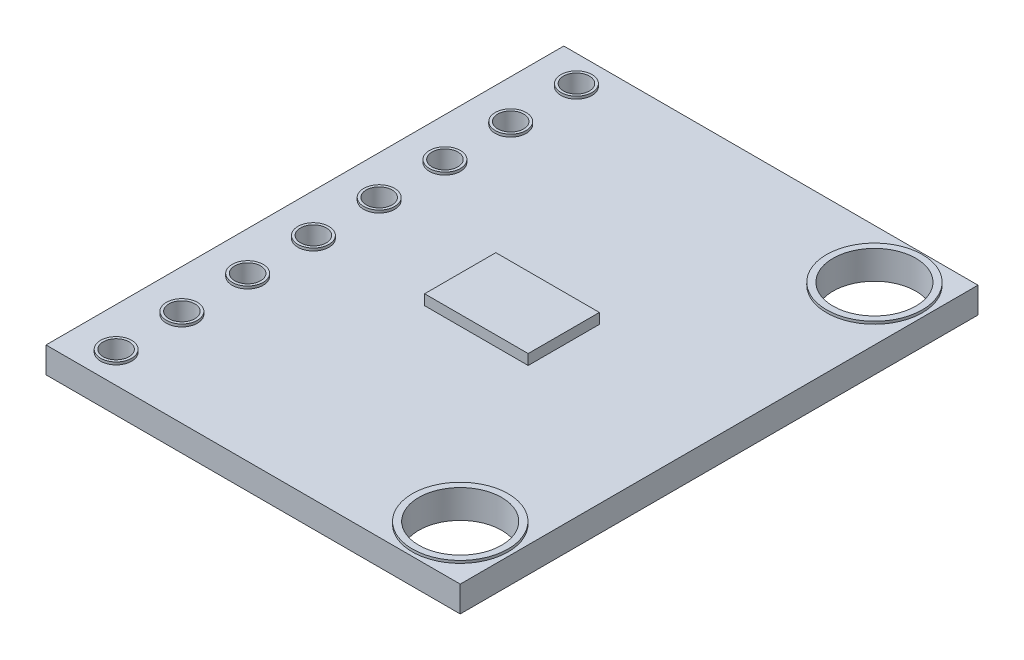
ISO-10303-21;
HEADER;
FILE_DESCRIPTION(('STEP AP214'),'2;1');
FILE_NAME('part.step','',(''),(''),'','','');
FILE_SCHEMA(('AUTOMOTIVE_DESIGN { 1 0 10303 214 1 1 1 1 }'));
ENDSEC;
DATA;
#1=APPLICATION_CONTEXT('core data for automotive mechanical design processes');
#2=APPLICATION_PROTOCOL_DEFINITION('international standard','automotive_design',2000,#1);
#3=PRODUCT_CONTEXT('',#1,'mechanical');
#4=PRODUCT('Part','Part','',(#3));
#5=PRODUCT_RELATED_PRODUCT_CATEGORY('part','',(#4));
#6=PRODUCT_DEFINITION_FORMATION('','',#4);
#7=PRODUCT_DEFINITION_CONTEXT('part definition',#1,'design');
#8=PRODUCT_DEFINITION('design','',#6,#7);
#9=PRODUCT_DEFINITION_SHAPE('','',#8);
#10=(LENGTH_UNIT() NAMED_UNIT(*) SI_UNIT(.MILLI.,.METRE.));
#11=(NAMED_UNIT(*) PLANE_ANGLE_UNIT() SI_UNIT($,.RADIAN.));
#12=(NAMED_UNIT(*) SI_UNIT($,.STERADIAN.) SOLID_ANGLE_UNIT());
#13=UNCERTAINTY_MEASURE_WITH_UNIT(LENGTH_MEASURE(1.E-05),#10,'distance_accuracy_value','');
#14=(GEOMETRIC_REPRESENTATION_CONTEXT(3) GLOBAL_UNCERTAINTY_ASSIGNED_CONTEXT((#13)) GLOBAL_UNIT_ASSIGNED_CONTEXT((#10,
#11,#12)) REPRESENTATION_CONTEXT('',''));
#15=CARTESIAN_POINT('',(0.,0.,0.));
#16=DIRECTION('',(0.,0.,1.));
#17=DIRECTION('',(1.,0.,0.));
#18=AXIS2_PLACEMENT_3D('',#15,#16,#17);
#19=CARTESIAN_POINT('',(2.,1.4,1.375));
#20=DIRECTION('',(-1.,0.,0.));
#21=DIRECTION('',(0.,0.,1.));
#22=AXIS2_PLACEMENT_3D('',#19,#20,#21);
#23=PLANE('',#22);
#24=DIRECTION('',(0.,0.,-1.));
#25=VECTOR('',#24,1.);
#26=CARTESIAN_POINT('',(2.,1.,1.375));
#27=LINE('',#26,#25);
#28=CARTESIAN_POINT('',(2.,1.,1.375));
#29=VERTEX_POINT('',#28);
#30=CARTESIAN_POINT('',(2.,1.,-1.375));
#31=VERTEX_POINT('',#30);
#32=EDGE_CURVE('E109',#29,#31,#27,.T.);
#33=ORIENTED_EDGE('',*,*,#32,.T.);
#34=DIRECTION('',(0.,-1.,0.));
#35=VECTOR('',#34,1.);
#36=CARTESIAN_POINT('',(2.,1.4,-1.375));
#37=LINE('',#36,#35);
#38=CARTESIAN_POINT('',(2.,1.4,-1.375));
#39=VERTEX_POINT('',#38);
#40=EDGE_CURVE('E12',#39,#31,#37,.T.);
#41=ORIENTED_EDGE('',*,*,#40,.F.);
#42=DIRECTION('',(0.,0.,-1.));
#43=VECTOR('',#42,1.);
#44=CARTESIAN_POINT('',(2.,1.4,1.375));
#45=LINE('',#44,#43);
#46=CARTESIAN_POINT('',(2.,1.4,1.375));
#47=VERTEX_POINT('',#46);
#48=EDGE_CURVE('E97',#47,#39,#45,.T.);
#49=ORIENTED_EDGE('',*,*,#48,.F.);
#50=DIRECTION('',(0.,-1.,0.));
#51=VECTOR('',#50,1.);
#52=CARTESIAN_POINT('',(2.,1.4,1.375));
#53=LINE('',#52,#51);
#54=EDGE_CURVE('E105',#47,#29,#53,.T.);
#55=ORIENTED_EDGE('',*,*,#54,.T.);
#56=EDGE_LOOP('',(#33,#41,#49,#55));
#57=FACE_BOUND('',#56,.T.);
#58=ADVANCED_FACE('F46',(#57),#23,.F.);
#59=CARTESIAN_POINT('',(-2.,1.4,-1.375));
#60=DIRECTION('',(0.,0.,1.));
#61=DIRECTION('',(1.,0.,0.));
#62=AXIS2_PLACEMENT_3D('',#59,#60,#61);
#63=PLANE('',#62);
#64=DIRECTION('',(-1.,0.,0.));
#65=VECTOR('',#64,1.);
#66=CARTESIAN_POINT('',(-2.,1.,-1.375));
#67=LINE('',#66,#65);
#68=CARTESIAN_POINT('',(-2.,1.,-1.375));
#69=VERTEX_POINT('',#68);
#70=EDGE_CURVE('E101',#31,#69,#67,.T.);
#71=ORIENTED_EDGE('',*,*,#70,.T.);
#72=DIRECTION('',(0.,-1.,0.));
#73=VECTOR('',#72,1.);
#74=CARTESIAN_POINT('',(-2.,1.4,-1.375));
#75=LINE('',#74,#73);
#76=CARTESIAN_POINT('',(-2.,1.4,-1.375));
#77=VERTEX_POINT('',#76);
#78=EDGE_CURVE('E54',#77,#69,#75,.T.);
#79=ORIENTED_EDGE('',*,*,#78,.F.);
#80=DIRECTION('',(-1.,0.,0.));
#81=VECTOR('',#80,1.);
#82=CARTESIAN_POINT('',(-2.,1.4,-1.375));
#83=LINE('',#82,#81);
#84=EDGE_CURVE('E92',#39,#77,#83,.T.);
#85=ORIENTED_EDGE('',*,*,#84,.F.);
#86=ORIENTED_EDGE('',*,*,#40,.T.);
#87=EDGE_LOOP('',(#71,#79,#85,#86));
#88=FACE_BOUND('',#87,.T.);
#89=ADVANCED_FACE('F100',(#88),#63,.F.);
#90=CARTESIAN_POINT('',(-2.,1.4,1.375));
#91=DIRECTION('',(1.,0.,0.));
#92=DIRECTION('',(0.,0.,-1.));
#93=AXIS2_PLACEMENT_3D('',#90,#91,#92);
#94=PLANE('',#93);
#95=DIRECTION('',(0.,0.,1.));
#96=VECTOR('',#95,1.);
#97=CARTESIAN_POINT('',(-2.,1.,1.375));
#98=LINE('',#97,#96);
#99=CARTESIAN_POINT('',(-2.,1.,1.375));
#100=VERTEX_POINT('',#99);
#101=EDGE_CURVE('E79',#69,#100,#98,.T.);
#102=ORIENTED_EDGE('',*,*,#101,.T.);
#103=DIRECTION('',(0.,-1.,0.));
#104=VECTOR('',#103,1.);
#105=CARTESIAN_POINT('',(-2.,1.4,1.375));
#106=LINE('',#105,#104);
#107=CARTESIAN_POINT('',(-2.,1.4,1.375));
#108=VERTEX_POINT('',#107);
#109=EDGE_CURVE('E102',#108,#100,#106,.T.);
#110=ORIENTED_EDGE('',*,*,#109,.F.);
#111=DIRECTION('',(0.,0.,1.));
#112=VECTOR('',#111,1.);
#113=CARTESIAN_POINT('',(-2.,1.4,1.375));
#114=LINE('',#113,#112);
#115=EDGE_CURVE('E95',#77,#108,#114,.T.);
#116=ORIENTED_EDGE('',*,*,#115,.F.);
#117=ORIENTED_EDGE('',*,*,#78,.T.);
#118=EDGE_LOOP('',(#102,#110,#116,#117));
#119=FACE_BOUND('',#118,.T.);
#120=ADVANCED_FACE('F103',(#119),#94,.F.);
#121=CARTESIAN_POINT('',(-2.,1.4,1.375));
#122=DIRECTION('',(0.,0.,-1.));
#123=DIRECTION('',(-1.,0.,0.));
#124=AXIS2_PLACEMENT_3D('',#121,#122,#123);
#125=PLANE('',#124);
#126=DIRECTION('',(1.,0.,0.));
#127=VECTOR('',#126,1.);
#128=CARTESIAN_POINT('',(-2.,1.,1.375));
#129=LINE('',#128,#127);
#130=EDGE_CURVE('E85',#100,#29,#129,.T.);
#131=ORIENTED_EDGE('',*,*,#130,.T.);
#132=ORIENTED_EDGE('',*,*,#54,.F.);
#133=DIRECTION('',(1.,0.,0.));
#134=VECTOR('',#133,1.);
#135=CARTESIAN_POINT('',(-2.,1.4,1.375));
#136=LINE('',#135,#134);
#137=EDGE_CURVE('E62',#108,#47,#136,.T.);
#138=ORIENTED_EDGE('',*,*,#137,.F.);
#139=ORIENTED_EDGE('',*,*,#109,.T.);
#140=EDGE_LOOP('',(#131,#132,#138,#139));
#141=FACE_BOUND('',#140,.T.);
#142=ADVANCED_FACE('F116',(#141),#125,.F.);
#143=CARTESIAN_POINT('',(0.,1.4,0.));
#144=DIRECTION('',(0.,-1.,0.));
#145=DIRECTION('',(0.,0.,-1.));
#146=AXIS2_PLACEMENT_3D('',#143,#144,#145);
#147=PLANE('',#146);
#148=ORIENTED_EDGE('',*,*,#48,.T.);
#149=ORIENTED_EDGE('',*,*,#84,.T.);
#150=ORIENTED_EDGE('',*,*,#115,.T.);
#151=ORIENTED_EDGE('',*,*,#137,.T.);
#152=EDGE_LOOP('',(#148,#149,#150,#151));
#153=FACE_BOUND('',#152,.T.);
#154=ADVANCED_FACE('F93',(#153),#147,.F.);
#155=CARTESIAN_POINT('',(0.,1.,0.));
#156=DIRECTION('',(0.,-1.,0.));
#157=DIRECTION('',(0.,0.,-1.));
#158=AXIS2_PLACEMENT_3D('',#155,#156,#157);
#159=PLANE('',#158);
#160=ORIENTED_EDGE('',*,*,#32,.F.);
#161=ORIENTED_EDGE('',*,*,#130,.F.);
#162=ORIENTED_EDGE('',*,*,#101,.F.);
#163=ORIENTED_EDGE('',*,*,#70,.F.);
#164=EDGE_LOOP('',(#160,#161,#162,#163));
#165=FACE_BOUND('',#164,.T.);
#166=ADVANCED_FACE('F119',(#165),#159,.T.);
#167=CLOSED_SHELL('',(#58,#89,#120,#142,#154,#166));
#168=MANIFOLD_SOLID_BREP('B2',#167);
#169=CARTESIAN_POINT('',(8.,1.,10.));
#170=DIRECTION('',(-1.,0.,0.));
#171=DIRECTION('',(0.,0.,1.));
#172=AXIS2_PLACEMENT_3D('',#169,#170,#171);
#173=PLANE('',#172);
#174=DIRECTION('',(0.,0.,-1.));
#175=VECTOR('',#174,1.);
#176=CARTESIAN_POINT('',(8.,0.,10.));
#177=LINE('',#176,#175);
#178=CARTESIAN_POINT('',(8.,0.,10.));
#179=VERTEX_POINT('',#178);
#180=CARTESIAN_POINT('',(8.,0.,-10.));
#181=VERTEX_POINT('',#180);
#182=EDGE_CURVE('E238',#179,#181,#177,.T.);
#183=ORIENTED_EDGE('',*,*,#182,.T.);
#184=DIRECTION('',(0.,-1.,0.));
#185=VECTOR('',#184,1.);
#186=CARTESIAN_POINT('',(8.,1.,-10.));
#187=LINE('',#186,#185);
#188=CARTESIAN_POINT('',(8.,1.,-10.));
#189=VERTEX_POINT('',#188);
#190=EDGE_CURVE('E229',#189,#181,#187,.T.);
#191=ORIENTED_EDGE('',*,*,#190,.F.);
#192=DIRECTION('',(0.,0.,-1.));
#193=VECTOR('',#192,1.);
#194=CARTESIAN_POINT('',(8.,1.,10.));
#195=LINE('',#194,#193);
#196=CARTESIAN_POINT('',(8.,1.,10.));
#197=VERTEX_POINT('',#196);
#198=EDGE_CURVE('E223',#197,#189,#195,.T.);
#199=ORIENTED_EDGE('',*,*,#198,.F.);
#200=DIRECTION('',(0.,-1.,0.));
#201=VECTOR('',#200,1.);
#202=CARTESIAN_POINT('',(8.,1.,10.));
#203=LINE('',#202,#201);
#204=EDGE_CURVE('E234',#197,#179,#203,.T.);
#205=ORIENTED_EDGE('',*,*,#204,.T.);
#206=EDGE_LOOP('',(#183,#191,#199,#205));
#207=FACE_BOUND('',#206,.T.);
#208=ADVANCED_FACE('F169',(#207),#173,.F.);
#209=CARTESIAN_POINT('',(-8.,1.,-10.));
#210=DIRECTION('',(0.,0.,1.));
#211=DIRECTION('',(1.,0.,0.));
#212=AXIS2_PLACEMENT_3D('',#209,#210,#211);
#213=PLANE('',#212);
#214=DIRECTION('',(-1.,0.,0.));
#215=VECTOR('',#214,1.);
#216=CARTESIAN_POINT('',(-8.,0.,-10.));
#217=LINE('',#216,#215);
#218=CARTESIAN_POINT('',(-8.,0.,-10.));
#219=VERTEX_POINT('',#218);
#220=EDGE_CURVE('E228',#181,#219,#217,.T.);
#221=ORIENTED_EDGE('',*,*,#220,.T.);
#222=DIRECTION('',(0.,-1.,0.));
#223=VECTOR('',#222,1.);
#224=CARTESIAN_POINT('',(-8.,1.,-10.));
#225=LINE('',#224,#223);
#226=CARTESIAN_POINT('',(-8.,1.,-10.));
#227=VERTEX_POINT('',#226);
#228=EDGE_CURVE('E226',#227,#219,#225,.T.);
#229=ORIENTED_EDGE('',*,*,#228,.F.);
#230=DIRECTION('',(-1.,0.,0.));
#231=VECTOR('',#230,1.);
#232=CARTESIAN_POINT('',(-8.,1.,-10.));
#233=LINE('',#232,#231);
#234=EDGE_CURVE('E218',#189,#227,#233,.T.);
#235=ORIENTED_EDGE('',*,*,#234,.F.);
#236=ORIENTED_EDGE('',*,*,#190,.T.);
#237=EDGE_LOOP('',(#221,#229,#235,#236));
#238=FACE_BOUND('',#237,.T.);
#239=ADVANCED_FACE('F227',(#238),#213,.F.);
#240=CARTESIAN_POINT('',(-8.,1.,10.));
#241=DIRECTION('',(1.,0.,0.));
#242=DIRECTION('',(0.,0.,-1.));
#243=AXIS2_PLACEMENT_3D('',#240,#241,#242);
#244=PLANE('',#243);
#245=DIRECTION('',(0.,0.,1.));
#246=VECTOR('',#245,1.);
#247=CARTESIAN_POINT('',(-8.,0.,10.));
#248=LINE('',#247,#246);
#249=CARTESIAN_POINT('',(-8.,0.,10.));
#250=VERTEX_POINT('',#249);
#251=EDGE_CURVE('E204',#219,#250,#248,.T.);
#252=ORIENTED_EDGE('',*,*,#251,.T.);
#253=DIRECTION('',(0.,-1.,0.));
#254=VECTOR('',#253,1.);
#255=CARTESIAN_POINT('',(-8.,1.,10.));
#256=LINE('',#255,#254);
#257=CARTESIAN_POINT('',(-8.,1.,10.));
#258=VERTEX_POINT('',#257);
#259=EDGE_CURVE('E230',#258,#250,#256,.T.);
#260=ORIENTED_EDGE('',*,*,#259,.F.);
#261=DIRECTION('',(0.,0.,1.));
#262=VECTOR('',#261,1.);
#263=CARTESIAN_POINT('',(-8.,1.,10.));
#264=LINE('',#263,#262);
#265=EDGE_CURVE('E221',#227,#258,#264,.T.);
#266=ORIENTED_EDGE('',*,*,#265,.F.);
#267=ORIENTED_EDGE('',*,*,#228,.T.);
#268=EDGE_LOOP('',(#252,#260,#266,#267));
#269=FACE_BOUND('',#268,.T.);
#270=ADVANCED_FACE('F232',(#269),#244,.F.);
#271=CARTESIAN_POINT('',(-8.,1.,10.));
#272=DIRECTION('',(0.,0.,-1.));
#273=DIRECTION('',(-1.,0.,0.));
#274=AXIS2_PLACEMENT_3D('',#271,#272,#273);
#275=PLANE('',#274);
#276=DIRECTION('',(1.,0.,0.));
#277=VECTOR('',#276,1.);
#278=CARTESIAN_POINT('',(-8.,0.,10.));
#279=LINE('',#278,#277);
#280=EDGE_CURVE('E210',#250,#179,#279,.T.);
#281=ORIENTED_EDGE('',*,*,#280,.T.);
#282=ORIENTED_EDGE('',*,*,#204,.F.);
#283=DIRECTION('',(1.,0.,0.));
#284=VECTOR('',#283,1.);
#285=CARTESIAN_POINT('',(-8.,1.,10.));
#286=LINE('',#285,#284);
#287=EDGE_CURVE('E187',#258,#197,#286,.T.);
#288=ORIENTED_EDGE('',*,*,#287,.F.);
#289=ORIENTED_EDGE('',*,*,#259,.T.);
#290=EDGE_LOOP('',(#281,#282,#288,#289));
#291=FACE_BOUND('',#290,.T.);
#292=ADVANCED_FACE('F379',(#291),#275,.F.);
#293=CARTESIAN_POINT('',(0.,1.,0.));
#294=DIRECTION('',(0.,-1.,0.));
#295=DIRECTION('',(0.,0.,-1.));
#296=AXIS2_PLACEMENT_3D('',#293,#294,#295);
#297=PLANE('',#296);
#298=CARTESIAN_POINT('',(6.,1.,-8.));
#299=DIRECTION('',(0.,-1.,0.));
#300=DIRECTION('',(0.,0.,-1.));
#301=AXIS2_PLACEMENT_3D('',#298,#299,#300);
#302=CIRCLE('',#301,1.85);
#303=CARTESIAN_POINT('',(6.,1.,-9.85));
#304=VERTEX_POINT('',#303);
#305=EDGE_CURVE('E44',#304,#304,#302,.F.);
#306=ORIENTED_EDGE('',*,*,#305,.F.);
#307=EDGE_LOOP('',(#306));
#308=FACE_BOUND('',#307,.T.);
#309=CARTESIAN_POINT('',(6.,1.,8.));
#310=DIRECTION('',(0.,-1.,0.));
#311=DIRECTION('',(0.,0.,-1.));
#312=AXIS2_PLACEMENT_3D('',#309,#310,#311);
#313=CIRCLE('',#312,1.85);
#314=CARTESIAN_POINT('',(6.,1.,6.15));
#315=VERTEX_POINT('',#314);
#316=EDGE_CURVE('E178',#315,#315,#313,.F.);
#317=ORIENTED_EDGE('',*,*,#316,.F.);
#318=EDGE_LOOP('',(#317));
#319=FACE_BOUND('',#318,.T.);
#320=CARTESIAN_POINT('',(-6.40078584342518,1.,-8.89000000000001));
#321=DIRECTION('',(0.,-1.,0.));
#322=DIRECTION('',(0.,0.,-1.));
#323=AXIS2_PLACEMENT_3D('',#320,#321,#322);
#324=CIRCLE('',#323,0.6);
#325=CARTESIAN_POINT('',(-6.40078584342518,1.,-9.49000000000001));
#326=VERTEX_POINT('',#325);
#327=EDGE_CURVE('E269',#326,#326,#324,.F.);
#328=ORIENTED_EDGE('',*,*,#327,.F.);
#329=EDGE_LOOP('',(#328));
#330=FACE_BOUND('',#329,.T.);
#331=CARTESIAN_POINT('',(-6.40078584342518,1.,-6.35));
#332=DIRECTION('',(0.,-1.,0.));
#333=DIRECTION('',(0.,0.,-1.));
#334=AXIS2_PLACEMENT_3D('',#331,#332,#333);
#335=CIRCLE('',#334,0.6);
#336=CARTESIAN_POINT('',(-6.40078584342518,1.,-6.95));
#337=VERTEX_POINT('',#336);
#338=EDGE_CURVE('E266',#337,#337,#335,.F.);
#339=ORIENTED_EDGE('',*,*,#338,.F.);
#340=EDGE_LOOP('',(#339));
#341=FACE_BOUND('',#340,.T.);
#342=CARTESIAN_POINT('',(-6.40078584342518,1.,-3.81));
#343=DIRECTION('',(0.,-1.,0.));
#344=DIRECTION('',(0.,0.,-1.));
#345=AXIS2_PLACEMENT_3D('',#342,#343,#344);
#346=CIRCLE('',#345,0.6);
#347=CARTESIAN_POINT('',(-6.40078584342518,1.,-4.41));
#348=VERTEX_POINT('',#347);
#349=EDGE_CURVE('E263',#348,#348,#346,.F.);
#350=ORIENTED_EDGE('',*,*,#349,.F.);
#351=EDGE_LOOP('',(#350));
#352=FACE_BOUND('',#351,.T.);
#353=CARTESIAN_POINT('',(-6.40078584342518,1.,-1.27));
#354=DIRECTION('',(0.,-1.,0.));
#355=DIRECTION('',(0.,0.,-1.));
#356=AXIS2_PLACEMENT_3D('',#353,#354,#355);
#357=CIRCLE('',#356,0.6);
#358=CARTESIAN_POINT('',(-6.40078584342518,1.,-1.87));
#359=VERTEX_POINT('',#358);
#360=EDGE_CURVE('E260',#359,#359,#357,.F.);
#361=ORIENTED_EDGE('',*,*,#360,.F.);
#362=EDGE_LOOP('',(#361));
#363=FACE_BOUND('',#362,.T.);
#364=CARTESIAN_POINT('',(-6.40078584342518,1.,8.89));
#365=DIRECTION('',(0.,-1.,0.));
#366=DIRECTION('',(0.,0.,-1.));
#367=AXIS2_PLACEMENT_3D('',#364,#365,#366);
#368=CIRCLE('',#367,0.6);
#369=CARTESIAN_POINT('',(-6.40078584342518,1.,8.29));
#370=VERTEX_POINT('',#369);
#371=EDGE_CURVE('E257',#370,#370,#368,.F.);
#372=ORIENTED_EDGE('',*,*,#371,.F.);
#373=EDGE_LOOP('',(#372));
#374=FACE_BOUND('',#373,.T.);
#375=CARTESIAN_POINT('',(-6.40078584342518,1.,1.27));
#376=DIRECTION('',(0.,-1.,0.));
#377=DIRECTION('',(0.,0.,-1.));
#378=AXIS2_PLACEMENT_3D('',#375,#376,#377);
#379=CIRCLE('',#378,0.6);
#380=CARTESIAN_POINT('',(-6.40078584342518,1.,0.669999999999995));
#381=VERTEX_POINT('',#380);
#382=EDGE_CURVE('E254',#381,#381,#379,.F.);
#383=ORIENTED_EDGE('',*,*,#382,.F.);
#384=EDGE_LOOP('',(#383));
#385=FACE_BOUND('',#384,.T.);
#386=CARTESIAN_POINT('',(-6.40078584342518,1.,3.81));
#387=DIRECTION('',(0.,-1.,0.));
#388=DIRECTION('',(0.,0.,-1.));
#389=AXIS2_PLACEMENT_3D('',#386,#387,#388);
#390=CIRCLE('',#389,0.6);
#391=CARTESIAN_POINT('',(-6.40078584342518,1.,3.21));
#392=VERTEX_POINT('',#391);
#393=EDGE_CURVE('E251',#392,#392,#390,.F.);
#394=ORIENTED_EDGE('',*,*,#393,.F.);
#395=EDGE_LOOP('',(#394));
#396=FACE_BOUND('',#395,.T.);
#397=CARTESIAN_POINT('',(-6.40078584342518,1.,6.35));
#398=DIRECTION('',(0.,-1.,0.));
#399=DIRECTION('',(0.,0.,-1.));
#400=AXIS2_PLACEMENT_3D('',#397,#398,#399);
#401=CIRCLE('',#400,0.6);
#402=CARTESIAN_POINT('',(-6.40078584342518,1.,5.75));
#403=VERTEX_POINT('',#402);
#404=EDGE_CURVE('E248',#403,#403,#401,.F.);
#405=ORIENTED_EDGE('',*,*,#404,.F.);
#406=EDGE_LOOP('',(#405));
#407=FACE_BOUND('',#406,.T.);
#408=ORIENTED_EDGE('',*,*,#198,.T.);
#409=ORIENTED_EDGE('',*,*,#234,.T.);
#410=ORIENTED_EDGE('',*,*,#265,.T.);
#411=ORIENTED_EDGE('',*,*,#287,.T.);
#412=EDGE_LOOP('',(#408,#409,#410,#411));
#413=FACE_BOUND('',#412,.T.);
#414=ADVANCED_FACE('F219',(#308,#319,#330,#341,#352,#363,#374,#385,#396,#407,#413),#297,.F.);
#415=CARTESIAN_POINT('',(0.,0.,0.));
#416=DIRECTION('',(0.,-1.,0.));
#417=DIRECTION('',(0.,0.,-1.));
#418=AXIS2_PLACEMENT_3D('',#415,#416,#417);
#419=PLANE('',#418);
#420=CARTESIAN_POINT('',(6.,0.,-8.));
#421=DIRECTION('',(0.,-1.,0.));
#422=DIRECTION('',(0.,0.,-1.));
#423=AXIS2_PLACEMENT_3D('',#420,#421,#422);
#424=CIRCLE('',#423,1.6);
#425=CARTESIAN_POINT('',(6.,0.,-9.6));
#426=VERTEX_POINT('',#425);
#427=EDGE_CURVE('E172',#426,#426,#424,.T.);
#428=ORIENTED_EDGE('',*,*,#427,.F.);
#429=EDGE_LOOP('',(#428));
#430=FACE_BOUND('',#429,.T.);
#431=CARTESIAN_POINT('',(6.,0.,8.));
#432=DIRECTION('',(0.,-1.,0.));
#433=DIRECTION('',(0.,0.,-1.));
#434=AXIS2_PLACEMENT_3D('',#431,#432,#433);
#435=CIRCLE('',#434,1.6);
#436=CARTESIAN_POINT('',(6.,0.,6.4));
#437=VERTEX_POINT('',#436);
#438=EDGE_CURVE('E299',#437,#437,#435,.T.);
#439=ORIENTED_EDGE('',*,*,#438,.F.);
#440=EDGE_LOOP('',(#439));
#441=FACE_BOUND('',#440,.T.);
#442=CARTESIAN_POINT('',(-6.40078584342518,0.,8.89));
#443=DIRECTION('',(0.,-1.,0.));
#444=DIRECTION('',(0.,0.,-1.));
#445=AXIS2_PLACEMENT_3D('',#442,#443,#444);
#446=CIRCLE('',#445,0.500000000000001);
#447=CARTESIAN_POINT('',(-6.40078584342518,0.,8.39));
#448=VERTEX_POINT('',#447);
#449=EDGE_CURVE('E294',#448,#448,#446,.T.);
#450=ORIENTED_EDGE('',*,*,#449,.F.);
#451=EDGE_LOOP('',(#450));
#452=FACE_BOUND('',#451,.T.);
#453=CARTESIAN_POINT('',(-6.40078584342518,0.,6.35));
#454=DIRECTION('',(0.,-1.,0.));
#455=DIRECTION('',(0.,0.,-1.));
#456=AXIS2_PLACEMENT_3D('',#453,#454,#455);
#457=CIRCLE('',#456,0.5);
#458=CARTESIAN_POINT('',(-6.40078584342518,0.,5.85));
#459=VERTEX_POINT('',#458);
#460=EDGE_CURVE('E291',#459,#459,#457,.T.);
#461=ORIENTED_EDGE('',*,*,#460,.F.);
#462=EDGE_LOOP('',(#461));
#463=FACE_BOUND('',#462,.T.);
#464=CARTESIAN_POINT('',(-6.40078584342518,0.,3.81));
#465=DIRECTION('',(0.,-1.,0.));
#466=DIRECTION('',(0.,0.,-1.));
#467=AXIS2_PLACEMENT_3D('',#464,#465,#466);
#468=CIRCLE('',#467,0.500000000000002);
#469=CARTESIAN_POINT('',(-6.40078584342518,0.,3.30999999999999));
#470=VERTEX_POINT('',#469);
#471=EDGE_CURVE('E288',#470,#470,#468,.T.);
#472=ORIENTED_EDGE('',*,*,#471,.F.);
#473=EDGE_LOOP('',(#472));
#474=FACE_BOUND('',#473,.T.);
#475=CARTESIAN_POINT('',(-6.40078584342518,0.,1.27));
#476=DIRECTION('',(0.,-1.,0.));
#477=DIRECTION('',(0.,0.,-1.));
#478=AXIS2_PLACEMENT_3D('',#475,#476,#477);
#479=CIRCLE('',#478,0.500000000000002);
#480=CARTESIAN_POINT('',(-6.40078584342518,0.,0.769999999999994));
#481=VERTEX_POINT('',#480);
#482=EDGE_CURVE('E285',#481,#481,#479,.T.);
#483=ORIENTED_EDGE('',*,*,#482,.F.);
#484=EDGE_LOOP('',(#483));
#485=FACE_BOUND('',#484,.T.);
#486=CARTESIAN_POINT('',(-6.40078584342518,0.,-1.27));
#487=DIRECTION('',(0.,-1.,0.));
#488=DIRECTION('',(0.,0.,-1.));
#489=AXIS2_PLACEMENT_3D('',#486,#487,#488);
#490=CIRCLE('',#489,0.500000000000002);
#491=CARTESIAN_POINT('',(-6.40078584342518,0.,-1.77000000000001));
#492=VERTEX_POINT('',#491);
#493=EDGE_CURVE('E282',#492,#492,#490,.T.);
#494=ORIENTED_EDGE('',*,*,#493,.F.);
#495=EDGE_LOOP('',(#494));
#496=FACE_BOUND('',#495,.T.);
#497=CARTESIAN_POINT('',(-6.40078584342518,0.,-3.81));
#498=DIRECTION('',(0.,-1.,0.));
#499=DIRECTION('',(0.,0.,-1.));
#500=AXIS2_PLACEMENT_3D('',#497,#498,#499);
#501=CIRCLE('',#500,0.500000000000002);
#502=CARTESIAN_POINT('',(-6.40078584342518,0.,-4.31));
#503=VERTEX_POINT('',#502);
#504=EDGE_CURVE('E279',#503,#503,#501,.T.);
#505=ORIENTED_EDGE('',*,*,#504,.F.);
#506=EDGE_LOOP('',(#505));
#507=FACE_BOUND('',#506,.T.);
#508=CARTESIAN_POINT('',(-6.40078584342518,0.,-6.35));
#509=DIRECTION('',(0.,-1.,0.));
#510=DIRECTION('',(0.,0.,-1.));
#511=AXIS2_PLACEMENT_3D('',#508,#509,#510);
#512=CIRCLE('',#511,0.500000000000002);
#513=CARTESIAN_POINT('',(-6.40078584342518,0.,-6.85000000000001));
#514=VERTEX_POINT('',#513);
#515=EDGE_CURVE('E275',#514,#514,#512,.T.);
#516=ORIENTED_EDGE('',*,*,#515,.F.);
#517=EDGE_LOOP('',(#516));
#518=FACE_BOUND('',#517,.T.);
#519=CARTESIAN_POINT('',(-6.40078584342518,0.,-8.89000000000001));
#520=DIRECTION('',(0.,-1.,0.));
#521=DIRECTION('',(0.,0.,-1.));
#522=AXIS2_PLACEMENT_3D('',#519,#520,#521);
#523=CIRCLE('',#522,0.500000000000003);
#524=CARTESIAN_POINT('',(-6.40078584342518,0.,-9.39000000000001));
#525=VERTEX_POINT('',#524);
#526=EDGE_CURVE('E272',#525,#525,#523,.T.);
#527=ORIENTED_EDGE('',*,*,#526,.F.);
#528=EDGE_LOOP('',(#527));
#529=FACE_BOUND('',#528,.T.);
#530=ORIENTED_EDGE('',*,*,#182,.F.);
#531=ORIENTED_EDGE('',*,*,#280,.F.);
#532=ORIENTED_EDGE('',*,*,#251,.F.);
#533=ORIENTED_EDGE('',*,*,#220,.F.);
#534=EDGE_LOOP('',(#530,#531,#532,#533));
#535=FACE_BOUND('',#534,.T.);
#536=ADVANCED_FACE('F378',(#430,#441,#452,#463,#474,#485,#496,#507,#518,#529,#535),#419,.T.);
#537=CARTESIAN_POINT('',(-6.40078584342518,1.1,6.35));
#538=DIRECTION('',(0.,1.,0.));
#539=DIRECTION('',(0.,0.,1.));
#540=AXIS2_PLACEMENT_3D('',#537,#538,#539);
#541=PLANE('',#540);
#542=CARTESIAN_POINT('',(-6.40078584342518,1.1,6.35));
#543=DIRECTION('',(0.,1.,0.));
#544=DIRECTION('',(0.,0.,1.));
#545=AXIS2_PLACEMENT_3D('',#542,#543,#544);
#546=CIRCLE('',#545,0.6);
#547=CARTESIAN_POINT('',(-6.40078584342518,1.1,6.95));
#548=VERTEX_POINT('',#547);
#549=EDGE_CURVE('E241',#548,#548,#546,.T.);
#550=ORIENTED_EDGE('',*,*,#549,.T.);
#551=EDGE_LOOP('',(#550));
#552=FACE_BOUND('',#551,.T.);
#553=CARTESIAN_POINT('',(-6.40078584342518,1.1,6.35));
#554=DIRECTION('',(0.,1.,0.));
#555=DIRECTION('',(0.,0.,1.));
#556=AXIS2_PLACEMENT_3D('',#553,#554,#555);
#557=CIRCLE('',#556,0.500000000000001);
#558=CARTESIAN_POINT('',(-6.40078584342518,1.1,6.85));
#559=VERTEX_POINT('',#558);
#560=EDGE_CURVE('E361',#559,#559,#557,.T.);
#561=ORIENTED_EDGE('',*,*,#560,.F.);
#562=EDGE_LOOP('',(#561));
#563=FACE_BOUND('',#562,.T.);
#564=ADVANCED_FACE('F367',(#552,#563),#541,.T.);
#565=CARTESIAN_POINT('',(-6.40078584342518,1.1,6.35));
#566=DIRECTION('',(0.,-1.,0.));
#567=DIRECTION('',(0.,0.,-1.));
#568=AXIS2_PLACEMENT_3D('',#565,#566,#567);
#569=CYLINDRICAL_SURFACE('',#568,0.6);
#570=ORIENTED_EDGE('',*,*,#549,.F.);
#571=EDGE_LOOP('',(#570));
#572=FACE_BOUND('',#571,.T.);
#573=ORIENTED_EDGE('',*,*,#404,.T.);
#574=EDGE_LOOP('',(#573));
#575=FACE_BOUND('',#574,.T.);
#576=ADVANCED_FACE('F370',(#572,#575),#569,.T.);
#577=CARTESIAN_POINT('',(-6.40078584342518,1.1,6.35));
#578=DIRECTION('',(0.,-1.,0.));
#579=DIRECTION('',(0.,0.,-1.));
#580=AXIS2_PLACEMENT_3D('',#577,#578,#579);
#581=CYLINDRICAL_SURFACE('',#580,0.500000000000001);
#582=ORIENTED_EDGE('',*,*,#560,.T.);
#583=EDGE_LOOP('',(#582));
#584=FACE_BOUND('',#583,.T.);
#585=ORIENTED_EDGE('',*,*,#460,.T.);
#586=EDGE_LOOP('',(#585));
#587=FACE_BOUND('',#586,.T.);
#588=ADVANCED_FACE('F373',(#584,#587),#581,.F.);
#589=CARTESIAN_POINT('',(-6.40078584342518,1.1,3.81));
#590=DIRECTION('',(0.,1.,0.));
#591=DIRECTION('',(0.,0.,1.));
#592=AXIS2_PLACEMENT_3D('',#589,#590,#591);
#593=PLANE('',#592);
#594=CARTESIAN_POINT('',(-6.40078584342518,1.1,3.81));
#595=DIRECTION('',(0.,1.,0.));
#596=DIRECTION('',(0.,0.,1.));
#597=AXIS2_PLACEMENT_3D('',#594,#595,#596);
#598=CIRCLE('',#597,0.6);
#599=CARTESIAN_POINT('',(-6.40078584342518,1.1,4.41));
#600=VERTEX_POINT('',#599);
#601=EDGE_CURVE('E358',#600,#600,#598,.T.);
#602=ORIENTED_EDGE('',*,*,#601,.T.);
#603=EDGE_LOOP('',(#602));
#604=FACE_BOUND('',#603,.T.);
#605=CARTESIAN_POINT('',(-6.40078584342518,1.1,3.81));
#606=DIRECTION('',(0.,1.,0.));
#607=DIRECTION('',(0.,0.,1.));
#608=AXIS2_PLACEMENT_3D('',#605,#606,#607);
#609=CIRCLE('',#608,0.500000000000002);
#610=CARTESIAN_POINT('',(-6.40078584342518,1.1,4.31));
#611=VERTEX_POINT('',#610);
#612=EDGE_CURVE('E355',#611,#611,#609,.T.);
#613=ORIENTED_EDGE('',*,*,#612,.F.);
#614=EDGE_LOOP('',(#613));
#615=FACE_BOUND('',#614,.T.);
#616=ADVANCED_FACE('F431',(#604,#615),#593,.T.);
#617=CARTESIAN_POINT('',(-6.40078584342518,1.1,3.81));
#618=DIRECTION('',(0.,-1.,0.));
#619=DIRECTION('',(0.,0.,-1.));
#620=AXIS2_PLACEMENT_3D('',#617,#618,#619);
#621=CYLINDRICAL_SURFACE('',#620,0.6);
#622=ORIENTED_EDGE('',*,*,#601,.F.);
#623=EDGE_LOOP('',(#622));
#624=FACE_BOUND('',#623,.T.);
#625=ORIENTED_EDGE('',*,*,#393,.T.);
#626=EDGE_LOOP('',(#625));
#627=FACE_BOUND('',#626,.T.);
#628=ADVANCED_FACE('F436',(#624,#627),#621,.T.);
#629=CARTESIAN_POINT('',(-6.40078584342518,1.1,3.81));
#630=DIRECTION('',(0.,-1.,0.));
#631=DIRECTION('',(0.,0.,-1.));
#632=AXIS2_PLACEMENT_3D('',#629,#630,#631);
#633=CYLINDRICAL_SURFACE('',#632,0.500000000000002);
#634=ORIENTED_EDGE('',*,*,#612,.T.);
#635=EDGE_LOOP('',(#634));
#636=FACE_BOUND('',#635,.T.);
#637=ORIENTED_EDGE('',*,*,#471,.T.);
#638=EDGE_LOOP('',(#637));
#639=FACE_BOUND('',#638,.T.);
#640=ADVANCED_FACE('F446',(#636,#639),#633,.F.);
#641=CARTESIAN_POINT('',(-6.40078584342518,1.1,1.27));
#642=DIRECTION('',(0.,1.,0.));
#643=DIRECTION('',(0.,0.,1.));
#644=AXIS2_PLACEMENT_3D('',#641,#642,#643);
#645=PLANE('',#644);
#646=CARTESIAN_POINT('',(-6.40078584342518,1.1,1.27));
#647=DIRECTION('',(0.,1.,0.));
#648=DIRECTION('',(0.,0.,1.));
#649=AXIS2_PLACEMENT_3D('',#646,#647,#648);
#650=CIRCLE('',#649,0.6);
#651=CARTESIAN_POINT('',(-6.40078584342518,1.1,1.87));
#652=VERTEX_POINT('',#651);
#653=EDGE_CURVE('E352',#652,#652,#650,.T.);
#654=ORIENTED_EDGE('',*,*,#653,.T.);
#655=EDGE_LOOP('',(#654));
#656=FACE_BOUND('',#655,.T.);
#657=CARTESIAN_POINT('',(-6.40078584342518,1.1,1.27));
#658=DIRECTION('',(0.,1.,0.));
#659=DIRECTION('',(0.,0.,1.));
#660=AXIS2_PLACEMENT_3D('',#657,#658,#659);
#661=CIRCLE('',#660,0.500000000000002);
#662=CARTESIAN_POINT('',(-6.40078584342518,1.1,1.77));
#663=VERTEX_POINT('',#662);
#664=EDGE_CURVE('E349',#663,#663,#661,.T.);
#665=ORIENTED_EDGE('',*,*,#664,.F.);
#666=EDGE_LOOP('',(#665));
#667=FACE_BOUND('',#666,.T.);
#668=ADVANCED_FACE('F454',(#656,#667),#645,.T.);
#669=CARTESIAN_POINT('',(-6.40078584342518,1.1,1.27));
#670=DIRECTION('',(0.,-1.,0.));
#671=DIRECTION('',(0.,0.,-1.));
#672=AXIS2_PLACEMENT_3D('',#669,#670,#671);
#673=CYLINDRICAL_SURFACE('',#672,0.6);
#674=ORIENTED_EDGE('',*,*,#653,.F.);
#675=EDGE_LOOP('',(#674));
#676=FACE_BOUND('',#675,.T.);
#677=ORIENTED_EDGE('',*,*,#382,.T.);
#678=EDGE_LOOP('',(#677));
#679=FACE_BOUND('',#678,.T.);
#680=ADVANCED_FACE('F459',(#676,#679),#673,.T.);
#681=CARTESIAN_POINT('',(-6.40078584342518,1.1,1.27));
#682=DIRECTION('',(0.,-1.,0.));
#683=DIRECTION('',(0.,0.,-1.));
#684=AXIS2_PLACEMENT_3D('',#681,#682,#683);
#685=CYLINDRICAL_SURFACE('',#684,0.500000000000002);
#686=ORIENTED_EDGE('',*,*,#664,.T.);
#687=EDGE_LOOP('',(#686));
#688=FACE_BOUND('',#687,.T.);
#689=ORIENTED_EDGE('',*,*,#482,.T.);
#690=EDGE_LOOP('',(#689));
#691=FACE_BOUND('',#690,.T.);
#692=ADVANCED_FACE('F469',(#688,#691),#685,.F.);
#693=CARTESIAN_POINT('',(-6.40078584342518,1.1,8.89));
#694=DIRECTION('',(0.,1.,0.));
#695=DIRECTION('',(0.,0.,1.));
#696=AXIS2_PLACEMENT_3D('',#693,#694,#695);
#697=PLANE('',#696);
#698=CARTESIAN_POINT('',(-6.40078584342518,1.1,8.89));
#699=DIRECTION('',(0.,1.,0.));
#700=DIRECTION('',(0.,0.,1.));
#701=AXIS2_PLACEMENT_3D('',#698,#699,#700);
#702=CIRCLE('',#701,0.6);
#703=CARTESIAN_POINT('',(-6.40078584342518,1.1,9.49));
#704=VERTEX_POINT('',#703);
#705=EDGE_CURVE('E346',#704,#704,#702,.T.);
#706=ORIENTED_EDGE('',*,*,#705,.T.);
#707=EDGE_LOOP('',(#706));
#708=FACE_BOUND('',#707,.T.);
#709=CARTESIAN_POINT('',(-6.40078584342518,1.1,8.89));
#710=DIRECTION('',(0.,1.,0.));
#711=DIRECTION('',(0.,0.,1.));
#712=AXIS2_PLACEMENT_3D('',#709,#710,#711);
#713=CIRCLE('',#712,0.500000000000001);
#714=CARTESIAN_POINT('',(-6.40078584342518,1.1,9.39));
#715=VERTEX_POINT('',#714);
#716=EDGE_CURVE('E343',#715,#715,#713,.T.);
#717=ORIENTED_EDGE('',*,*,#716,.F.);
#718=EDGE_LOOP('',(#717));
#719=FACE_BOUND('',#718,.T.);
#720=ADVANCED_FACE('F477',(#708,#719),#697,.T.);
#721=CARTESIAN_POINT('',(-6.40078584342518,1.1,8.89));
#722=DIRECTION('',(0.,-1.,0.));
#723=DIRECTION('',(0.,0.,-1.));
#724=AXIS2_PLACEMENT_3D('',#721,#722,#723);
#725=CYLINDRICAL_SURFACE('',#724,0.6);
#726=ORIENTED_EDGE('',*,*,#705,.F.);
#727=EDGE_LOOP('',(#726));
#728=FACE_BOUND('',#727,.T.);
#729=ORIENTED_EDGE('',*,*,#371,.T.);
#730=EDGE_LOOP('',(#729));
#731=FACE_BOUND('',#730,.T.);
#732=ADVANCED_FACE('F482',(#728,#731),#725,.T.);
#733=CARTESIAN_POINT('',(-6.40078584342518,1.1,8.89));
#734=DIRECTION('',(0.,-1.,0.));
#735=DIRECTION('',(0.,0.,-1.));
#736=AXIS2_PLACEMENT_3D('',#733,#734,#735);
#737=CYLINDRICAL_SURFACE('',#736,0.500000000000001);
#738=ORIENTED_EDGE('',*,*,#716,.T.);
#739=EDGE_LOOP('',(#738));
#740=FACE_BOUND('',#739,.T.);
#741=ORIENTED_EDGE('',*,*,#449,.T.);
#742=EDGE_LOOP('',(#741));
#743=FACE_BOUND('',#742,.T.);
#744=ADVANCED_FACE('F492',(#740,#743),#737,.F.);
#745=CARTESIAN_POINT('',(-6.40078584342518,1.1,-1.27));
#746=DIRECTION('',(0.,1.,0.));
#747=DIRECTION('',(0.,0.,1.));
#748=AXIS2_PLACEMENT_3D('',#745,#746,#747);
#749=PLANE('',#748);
#750=CARTESIAN_POINT('',(-6.40078584342518,1.1,-1.27));
#751=DIRECTION('',(0.,1.,0.));
#752=DIRECTION('',(0.,0.,1.));
#753=AXIS2_PLACEMENT_3D('',#750,#751,#752);
#754=CIRCLE('',#753,0.6);
#755=CARTESIAN_POINT('',(-6.40078584342518,1.1,-0.670000000000004));
#756=VERTEX_POINT('',#755);
#757=EDGE_CURVE('E340',#756,#756,#754,.T.);
#758=ORIENTED_EDGE('',*,*,#757,.T.);
#759=EDGE_LOOP('',(#758));
#760=FACE_BOUND('',#759,.T.);
#761=CARTESIAN_POINT('',(-6.40078584342518,1.1,-1.27));
#762=DIRECTION('',(0.,1.,0.));
#763=DIRECTION('',(0.,0.,1.));
#764=AXIS2_PLACEMENT_3D('',#761,#762,#763);
#765=CIRCLE('',#764,0.500000000000002);
#766=CARTESIAN_POINT('',(-6.40078584342518,1.1,-0.770000000000003));
#767=VERTEX_POINT('',#766);
#768=EDGE_CURVE('E337',#767,#767,#765,.T.);
#769=ORIENTED_EDGE('',*,*,#768,.F.);
#770=EDGE_LOOP('',(#769));
#771=FACE_BOUND('',#770,.T.);
#772=ADVANCED_FACE('F500',(#760,#771),#749,.T.);
#773=CARTESIAN_POINT('',(-6.40078584342518,1.1,-1.27));
#774=DIRECTION('',(0.,-1.,0.));
#775=DIRECTION('',(0.,0.,-1.));
#776=AXIS2_PLACEMENT_3D('',#773,#774,#775);
#777=CYLINDRICAL_SURFACE('',#776,0.6);
#778=ORIENTED_EDGE('',*,*,#757,.F.);
#779=EDGE_LOOP('',(#778));
#780=FACE_BOUND('',#779,.T.);
#781=ORIENTED_EDGE('',*,*,#360,.T.);
#782=EDGE_LOOP('',(#781));
#783=FACE_BOUND('',#782,.T.);
#784=ADVANCED_FACE('F505',(#780,#783),#777,.T.);
#785=CARTESIAN_POINT('',(-6.40078584342518,1.1,-1.27));
#786=DIRECTION('',(0.,-1.,0.));
#787=DIRECTION('',(0.,0.,-1.));
#788=AXIS2_PLACEMENT_3D('',#785,#786,#787);
#789=CYLINDRICAL_SURFACE('',#788,0.500000000000002);
#790=ORIENTED_EDGE('',*,*,#768,.T.);
#791=EDGE_LOOP('',(#790));
#792=FACE_BOUND('',#791,.T.);
#793=ORIENTED_EDGE('',*,*,#493,.T.);
#794=EDGE_LOOP('',(#793));
#795=FACE_BOUND('',#794,.T.);
#796=ADVANCED_FACE('F515',(#792,#795),#789,.F.);
#797=CARTESIAN_POINT('',(-6.40078584342518,1.1,-3.81));
#798=DIRECTION('',(0.,1.,0.));
#799=DIRECTION('',(0.,0.,1.));
#800=AXIS2_PLACEMENT_3D('',#797,#798,#799);
#801=PLANE('',#800);
#802=CARTESIAN_POINT('',(-6.40078584342518,1.1,-3.81));
#803=DIRECTION('',(0.,1.,0.));
#804=DIRECTION('',(0.,0.,1.));
#805=AXIS2_PLACEMENT_3D('',#802,#803,#804);
#806=CIRCLE('',#805,0.6);
#807=CARTESIAN_POINT('',(-6.40078584342518,1.1,-3.21));
#808=VERTEX_POINT('',#807);
#809=EDGE_CURVE('E334',#808,#808,#806,.T.);
#810=ORIENTED_EDGE('',*,*,#809,.T.);
#811=EDGE_LOOP('',(#810));
#812=FACE_BOUND('',#811,.T.);
#813=CARTESIAN_POINT('',(-6.40078584342518,1.1,-3.81));
#814=DIRECTION('',(0.,1.,0.));
#815=DIRECTION('',(0.,0.,1.));
#816=AXIS2_PLACEMENT_3D('',#813,#814,#815);
#817=CIRCLE('',#816,0.500000000000002);
#818=CARTESIAN_POINT('',(-6.40078584342518,1.1,-3.31));
#819=VERTEX_POINT('',#818);
#820=EDGE_CURVE('E331',#819,#819,#817,.T.);
#821=ORIENTED_EDGE('',*,*,#820,.F.);
#822=EDGE_LOOP('',(#821));
#823=FACE_BOUND('',#822,.T.);
#824=ADVANCED_FACE('F523',(#812,#823),#801,.T.);
#825=CARTESIAN_POINT('',(-6.40078584342518,1.1,-3.81));
#826=DIRECTION('',(0.,-1.,0.));
#827=DIRECTION('',(0.,0.,-1.));
#828=AXIS2_PLACEMENT_3D('',#825,#826,#827);
#829=CYLINDRICAL_SURFACE('',#828,0.6);
#830=ORIENTED_EDGE('',*,*,#809,.F.);
#831=EDGE_LOOP('',(#830));
#832=FACE_BOUND('',#831,.T.);
#833=ORIENTED_EDGE('',*,*,#349,.T.);
#834=EDGE_LOOP('',(#833));
#835=FACE_BOUND('',#834,.T.);
#836=ADVANCED_FACE('F528',(#832,#835),#829,.T.);
#837=CARTESIAN_POINT('',(-6.40078584342518,1.1,-3.81));
#838=DIRECTION('',(0.,-1.,0.));
#839=DIRECTION('',(0.,0.,-1.));
#840=AXIS2_PLACEMENT_3D('',#837,#838,#839);
#841=CYLINDRICAL_SURFACE('',#840,0.500000000000002);
#842=ORIENTED_EDGE('',*,*,#820,.T.);
#843=EDGE_LOOP('',(#842));
#844=FACE_BOUND('',#843,.T.);
#845=ORIENTED_EDGE('',*,*,#504,.T.);
#846=EDGE_LOOP('',(#845));
#847=FACE_BOUND('',#846,.T.);
#848=ADVANCED_FACE('F538',(#844,#847),#841,.F.);
#849=CARTESIAN_POINT('',(-6.40078584342518,1.1,-6.35));
#850=DIRECTION('',(0.,1.,0.));
#851=DIRECTION('',(0.,0.,1.));
#852=AXIS2_PLACEMENT_3D('',#849,#850,#851);
#853=PLANE('',#852);
#854=CARTESIAN_POINT('',(-6.40078584342518,1.1,-6.35));
#855=DIRECTION('',(0.,1.,0.));
#856=DIRECTION('',(0.,0.,1.));
#857=AXIS2_PLACEMENT_3D('',#854,#855,#856);
#858=CIRCLE('',#857,0.6);
#859=CARTESIAN_POINT('',(-6.40078584342518,1.1,-5.75000000000001));
#860=VERTEX_POINT('',#859);
#861=EDGE_CURVE('E328',#860,#860,#858,.T.);
#862=ORIENTED_EDGE('',*,*,#861,.T.);
#863=EDGE_LOOP('',(#862));
#864=FACE_BOUND('',#863,.T.);
#865=CARTESIAN_POINT('',(-6.40078584342518,1.1,-6.35));
#866=DIRECTION('',(0.,1.,0.));
#867=DIRECTION('',(0.,0.,1.));
#868=AXIS2_PLACEMENT_3D('',#865,#866,#867);
#869=CIRCLE('',#868,0.500000000000002);
#870=CARTESIAN_POINT('',(-6.40078584342518,1.1,-5.85));
#871=VERTEX_POINT('',#870);
#872=EDGE_CURVE('E325',#871,#871,#869,.T.);
#873=ORIENTED_EDGE('',*,*,#872,.F.);
#874=EDGE_LOOP('',(#873));
#875=FACE_BOUND('',#874,.T.);
#876=ADVANCED_FACE('F546',(#864,#875),#853,.T.);
#877=CARTESIAN_POINT('',(-6.40078584342518,1.1,-6.35));
#878=DIRECTION('',(0.,-1.,0.));
#879=DIRECTION('',(0.,0.,-1.));
#880=AXIS2_PLACEMENT_3D('',#877,#878,#879);
#881=CYLINDRICAL_SURFACE('',#880,0.6);
#882=ORIENTED_EDGE('',*,*,#861,.F.);
#883=EDGE_LOOP('',(#882));
#884=FACE_BOUND('',#883,.T.);
#885=ORIENTED_EDGE('',*,*,#338,.T.);
#886=EDGE_LOOP('',(#885));
#887=FACE_BOUND('',#886,.T.);
#888=ADVANCED_FACE('F551',(#884,#887),#881,.T.);
#889=CARTESIAN_POINT('',(-6.40078584342518,1.1,-6.35));
#890=DIRECTION('',(0.,-1.,0.));
#891=DIRECTION('',(0.,0.,-1.));
#892=AXIS2_PLACEMENT_3D('',#889,#890,#891);
#893=CYLINDRICAL_SURFACE('',#892,0.500000000000002);
#894=ORIENTED_EDGE('',*,*,#872,.T.);
#895=EDGE_LOOP('',(#894));
#896=FACE_BOUND('',#895,.T.);
#897=ORIENTED_EDGE('',*,*,#515,.T.);
#898=EDGE_LOOP('',(#897));
#899=FACE_BOUND('',#898,.T.);
#900=ADVANCED_FACE('F561',(#896,#899),#893,.F.);
#901=CARTESIAN_POINT('',(-6.40078584342518,1.1,-8.89000000000001));
#902=DIRECTION('',(0.,1.,0.));
#903=DIRECTION('',(0.,0.,1.));
#904=AXIS2_PLACEMENT_3D('',#901,#902,#903);
#905=PLANE('',#904);
#906=CARTESIAN_POINT('',(-6.40078584342518,1.1,-8.89000000000001));
#907=DIRECTION('',(0.,1.,0.));
#908=DIRECTION('',(0.,0.,1.));
#909=AXIS2_PLACEMENT_3D('',#906,#907,#908);
#910=CIRCLE('',#909,0.6);
#911=CARTESIAN_POINT('',(-6.40078584342518,1.1,-8.29000000000001));
#912=VERTEX_POINT('',#911);
#913=EDGE_CURVE('E322',#912,#912,#910,.T.);
#914=ORIENTED_EDGE('',*,*,#913,.T.);
#915=EDGE_LOOP('',(#914));
#916=FACE_BOUND('',#915,.T.);
#917=CARTESIAN_POINT('',(-6.40078584342518,1.1,-8.89000000000001));
#918=DIRECTION('',(0.,1.,0.));
#919=DIRECTION('',(0.,0.,1.));
#920=AXIS2_PLACEMENT_3D('',#917,#918,#919);
#921=CIRCLE('',#920,0.500000000000002);
#922=CARTESIAN_POINT('',(-6.40078584342518,1.1,-8.39));
#923=VERTEX_POINT('',#922);
#924=EDGE_CURVE('E297',#923,#923,#921,.T.);
#925=ORIENTED_EDGE('',*,*,#924,.F.);
#926=EDGE_LOOP('',(#925));
#927=FACE_BOUND('',#926,.T.);
#928=ADVANCED_FACE('F569',(#916,#927),#905,.T.);
#929=CARTESIAN_POINT('',(-6.40078584342518,1.1,-8.89000000000001));
#930=DIRECTION('',(0.,-1.,0.));
#931=DIRECTION('',(0.,0.,-1.));
#932=AXIS2_PLACEMENT_3D('',#929,#930,#931);
#933=CYLINDRICAL_SURFACE('',#932,0.6);
#934=ORIENTED_EDGE('',*,*,#913,.F.);
#935=EDGE_LOOP('',(#934));
#936=FACE_BOUND('',#935,.T.);
#937=ORIENTED_EDGE('',*,*,#327,.T.);
#938=EDGE_LOOP('',(#937));
#939=FACE_BOUND('',#938,.T.);
#940=ADVANCED_FACE('F574',(#936,#939),#933,.T.);
#941=CARTESIAN_POINT('',(-6.40078584342518,1.1,-8.89000000000001));
#942=DIRECTION('',(0.,-1.,0.));
#943=DIRECTION('',(0.,0.,-1.));
#944=AXIS2_PLACEMENT_3D('',#941,#942,#943);
#945=CYLINDRICAL_SURFACE('',#944,0.500000000000002);
#946=ORIENTED_EDGE('',*,*,#924,.T.);
#947=EDGE_LOOP('',(#946));
#948=FACE_BOUND('',#947,.T.);
#949=ORIENTED_EDGE('',*,*,#526,.T.);
#950=EDGE_LOOP('',(#949));
#951=FACE_BOUND('',#950,.T.);
#952=ADVANCED_FACE('F584',(#948,#951),#945,.F.);
#953=CARTESIAN_POINT('',(6.,1.1,8.));
#954=DIRECTION('',(0.,1.,0.));
#955=DIRECTION('',(0.,0.,1.));
#956=AXIS2_PLACEMENT_3D('',#953,#954,#955);
#957=PLANE('',#956);
#958=CARTESIAN_POINT('',(6.,1.1,8.));
#959=DIRECTION('',(0.,1.,0.));
#960=DIRECTION('',(0.,0.,1.));
#961=AXIS2_PLACEMENT_3D('',#958,#959,#960);
#962=CIRCLE('',#961,1.85);
#963=CARTESIAN_POINT('',(6.,1.1,9.85));
#964=VERTEX_POINT('',#963);
#965=EDGE_CURVE('E276',#964,#964,#962,.T.);
#966=ORIENTED_EDGE('',*,*,#965,.T.);
#967=EDGE_LOOP('',(#966));
#968=FACE_BOUND('',#967,.T.);
#969=CARTESIAN_POINT('',(6.,1.1,8.));
#970=DIRECTION('',(0.,1.,0.));
#971=DIRECTION('',(0.,0.,1.));
#972=AXIS2_PLACEMENT_3D('',#969,#970,#971);
#973=CIRCLE('',#972,1.6);
#974=CARTESIAN_POINT('',(6.,1.1,9.6));
#975=VERTEX_POINT('',#974);
#976=EDGE_CURVE('E313',#975,#975,#973,.T.);
#977=ORIENTED_EDGE('',*,*,#976,.F.);
#978=EDGE_LOOP('',(#977));
#979=FACE_BOUND('',#978,.T.);
#980=ADVANCED_FACE('F650',(#968,#979),#957,.T.);
#981=CARTESIAN_POINT('',(6.,1.1,8.));
#982=DIRECTION('',(0.,-1.,0.));
#983=DIRECTION('',(0.,0.,-1.));
#984=AXIS2_PLACEMENT_3D('',#981,#982,#983);
#985=CYLINDRICAL_SURFACE('',#984,1.85);
#986=ORIENTED_EDGE('',*,*,#965,.F.);
#987=EDGE_LOOP('',(#986));
#988=FACE_BOUND('',#987,.T.);
#989=ORIENTED_EDGE('',*,*,#316,.T.);
#990=EDGE_LOOP('',(#989));
#991=FACE_BOUND('',#990,.T.);
#992=ADVANCED_FACE('F664',(#988,#991),#985,.T.);
#993=CARTESIAN_POINT('',(6.,1.1,8.));
#994=DIRECTION('',(0.,-1.,0.));
#995=DIRECTION('',(0.,0.,-1.));
#996=AXIS2_PLACEMENT_3D('',#993,#994,#995);
#997=CYLINDRICAL_SURFACE('',#996,1.6);
#998=ORIENTED_EDGE('',*,*,#976,.T.);
#999=EDGE_LOOP('',(#998));
#1000=FACE_BOUND('',#999,.T.);
#1001=ORIENTED_EDGE('',*,*,#438,.T.);
#1002=EDGE_LOOP('',(#1001));
#1003=FACE_BOUND('',#1002,.T.);
#1004=ADVANCED_FACE('F674',(#1000,#1003),#997,.F.);
#1005=CARTESIAN_POINT('',(6.,1.1,-8.));
#1006=DIRECTION('',(0.,1.,0.));
#1007=DIRECTION('',(0.,0.,1.));
#1008=AXIS2_PLACEMENT_3D('',#1005,#1006,#1007);
#1009=PLANE('',#1008);
#1010=CARTESIAN_POINT('',(6.,1.1,-8.));
#1011=DIRECTION('',(0.,1.,0.));
#1012=DIRECTION('',(0.,0.,1.));
#1013=AXIS2_PLACEMENT_3D('',#1010,#1011,#1012);
#1014=CIRCLE('',#1013,1.85);
#1015=CARTESIAN_POINT('',(6.,1.1,-6.15));
#1016=VERTEX_POINT('',#1015);
#1017=EDGE_CURVE('E308',#1016,#1016,#1014,.T.);
#1018=ORIENTED_EDGE('',*,*,#1017,.T.);
#1019=EDGE_LOOP('',(#1018));
#1020=FACE_BOUND('',#1019,.T.);
#1021=CARTESIAN_POINT('',(6.,1.1,-8.));
#1022=DIRECTION('',(0.,1.,0.));
#1023=DIRECTION('',(0.,0.,1.));
#1024=AXIS2_PLACEMENT_3D('',#1021,#1022,#1023);
#1025=CIRCLE('',#1024,1.6);
#1026=CARTESIAN_POINT('',(6.,1.1,-6.4));
#1027=VERTEX_POINT('',#1026);
#1028=EDGE_CURVE('E304',#1027,#1027,#1025,.T.);
#1029=ORIENTED_EDGE('',*,*,#1028,.F.);
#1030=EDGE_LOOP('',(#1029));
#1031=FACE_BOUND('',#1030,.T.);
#1032=ADVANCED_FACE('F682',(#1020,#1031),#1009,.T.);
#1033=CARTESIAN_POINT('',(6.,1.1,-8.));
#1034=DIRECTION('',(0.,-1.,0.));
#1035=DIRECTION('',(0.,0.,-1.));
#1036=AXIS2_PLACEMENT_3D('',#1033,#1034,#1035);
#1037=CYLINDRICAL_SURFACE('',#1036,1.85);
#1038=ORIENTED_EDGE('',*,*,#1017,.F.);
#1039=EDGE_LOOP('',(#1038));
#1040=FACE_BOUND('',#1039,.T.);
#1041=ORIENTED_EDGE('',*,*,#305,.T.);
#1042=EDGE_LOOP('',(#1041));
#1043=FACE_BOUND('',#1042,.T.);
#1044=ADVANCED_FACE('F687',(#1040,#1043),#1037,.T.);
#1045=CARTESIAN_POINT('',(6.,1.1,-8.));
#1046=DIRECTION('',(0.,-1.,0.));
#1047=DIRECTION('',(0.,0.,-1.));
#1048=AXIS2_PLACEMENT_3D('',#1045,#1046,#1047);
#1049=CYLINDRICAL_SURFACE('',#1048,1.6);
#1050=ORIENTED_EDGE('',*,*,#1028,.T.);
#1051=EDGE_LOOP('',(#1050));
#1052=FACE_BOUND('',#1051,.T.);
#1053=ORIENTED_EDGE('',*,*,#427,.T.);
#1054=EDGE_LOOP('',(#1053));
#1055=FACE_BOUND('',#1054,.T.);
#1056=ADVANCED_FACE('F697',(#1052,#1055),#1049,.F.);
#1057=CLOSED_SHELL('',(#208,#239,#270,#292,#414,#536,#564,#576,#588,#616,#628,#640,#668,#680,
#692,#720,#732,#744,#772,#784,#796,#824,#836,#848,#876,#888,#900,#928,#940,#952,#980,#992,#1004,
#1032,#1044,#1056));
#1058=MANIFOLD_SOLID_BREP('B6',#1057);
#1059=ADVANCED_BREP_SHAPE_REPRESENTATION('',(#18,#168,#1058),#14);
#1060=SHAPE_DEFINITION_REPRESENTATION(#9,#1059);
ENDSEC;
END-ISO-10303-21;
